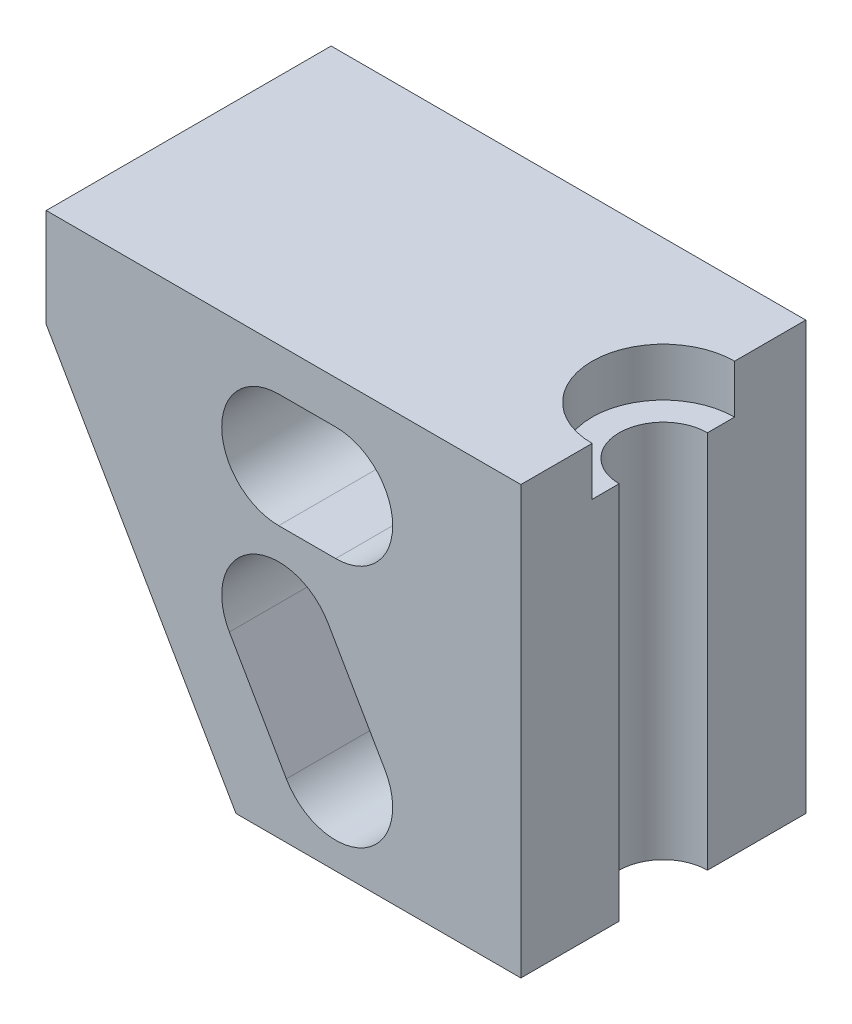
ISO-10303-21;
HEADER;
FILE_DESCRIPTION(('STEP AP214'),'2;1');
FILE_NAME('part.step','',(''),(''),'','','');
FILE_SCHEMA(('AUTOMOTIVE_DESIGN { 1 0 10303 214 1 1 1 1 }'));
ENDSEC;
DATA;
#1=APPLICATION_CONTEXT('core data for automotive mechanical design processes');
#2=APPLICATION_PROTOCOL_DEFINITION('international standard','automotive_design',2000,#1);
#3=PRODUCT_CONTEXT('',#1,'mechanical');
#4=PRODUCT('Part','Part','',(#3));
#5=PRODUCT_RELATED_PRODUCT_CATEGORY('part','',(#4));
#6=PRODUCT_DEFINITION_FORMATION('','',#4);
#7=PRODUCT_DEFINITION_CONTEXT('part definition',#1,'design');
#8=PRODUCT_DEFINITION('design','',#6,#7);
#9=PRODUCT_DEFINITION_SHAPE('','',#8);
#10=(LENGTH_UNIT() NAMED_UNIT(*) SI_UNIT(.MILLI.,.METRE.));
#11=(NAMED_UNIT(*) PLANE_ANGLE_UNIT() SI_UNIT($,.RADIAN.));
#12=(NAMED_UNIT(*) SI_UNIT($,.STERADIAN.) SOLID_ANGLE_UNIT());
#13=UNCERTAINTY_MEASURE_WITH_UNIT(LENGTH_MEASURE(1.E-05),#10,'distance_accuracy_value','');
#14=(GEOMETRIC_REPRESENTATION_CONTEXT(3) GLOBAL_UNCERTAINTY_ASSIGNED_CONTEXT((#13)) GLOBAL_UNIT_ASSIGNED_CONTEXT((#10,
#11,#12)) REPRESENTATION_CONTEXT('',''));
#15=CARTESIAN_POINT('',(0.,0.,0.));
#16=DIRECTION('',(0.,0.,1.));
#17=DIRECTION('',(1.,0.,0.));
#18=AXIS2_PLACEMENT_3D('',#15,#16,#17);
#19=CARTESIAN_POINT('',(0.,15.,5.));
#20=DIRECTION('',(0.,-1.,0.));
#21=DIRECTION('',(0.,0.,-1.));
#22=AXIS2_PLACEMENT_3D('',#19,#20,#21);
#23=CYLINDRICAL_SURFACE('',#22,1.55);
#24=CARTESIAN_POINT('',(0.,13.3,5.));
#25=DIRECTION('',(0.,1.,0.));
#26=DIRECTION('',(-1.,0.,0.));
#27=AXIS2_PLACEMENT_3D('',#24,#25,#26);
#28=CIRCLE('',#27,1.55);
#29=CARTESIAN_POINT('',(0.,13.3,6.55));
#30=VERTEX_POINT('',#29);
#31=CARTESIAN_POINT('',(0.,13.3,3.45));
#32=VERTEX_POINT('',#31);
#33=EDGE_CURVE('E12',#30,#32,#28,.F.);
#34=ORIENTED_EDGE('',*,*,#33,.F.);
#35=DIRECTION('',(0.,-1.,0.));
#36=VECTOR('',#35,1.);
#37=CARTESIAN_POINT('',(0.,15.,6.55));
#38=LINE('',#37,#36);
#39=CARTESIAN_POINT('',(0.,0.,6.55));
#40=VERTEX_POINT('',#39);
#41=EDGE_CURVE('E272',#40,#30,#38,.F.);
#42=ORIENTED_EDGE('',*,*,#41,.F.);
#43=CARTESIAN_POINT('',(0.,0.,5.));
#44=DIRECTION('',(0.,-1.,0.));
#45=DIRECTION('',(0.,0.,-1.));
#46=AXIS2_PLACEMENT_3D('',#43,#44,#45);
#47=CIRCLE('',#46,1.55);
#48=CARTESIAN_POINT('',(0.,0.,3.45));
#49=VERTEX_POINT('',#48);
#50=EDGE_CURVE('E362',#40,#49,#47,.T.);
#51=ORIENTED_EDGE('',*,*,#50,.T.);
#52=DIRECTION('',(0.,-1.,0.));
#53=VECTOR('',#52,1.);
#54=CARTESIAN_POINT('',(0.,15.,3.45));
#55=LINE('',#54,#53);
#56=EDGE_CURVE('E269',#32,#49,#55,.T.);
#57=ORIENTED_EDGE('',*,*,#56,.F.);
#58=EDGE_LOOP('',(#34,#42,#51,#57));
#59=FACE_BOUND('',#58,.T.);
#60=ADVANCED_FACE('F47',(#59),#23,.F.);
#61=CARTESIAN_POINT('',(0.,0.,10.));
#62=DIRECTION('',(-1.,0.,0.));
#63=DIRECTION('',(0.,0.,1.));
#64=AXIS2_PLACEMENT_3D('',#61,#62,#63);
#65=PLANE('',#64);
#66=DIRECTION('',(0.,0.,-1.));
#67=VECTOR('',#66,1.);
#68=CARTESIAN_POINT('',(0.,15.,10.));
#69=LINE('',#68,#67);
#70=CARTESIAN_POINT('',(0.,15.,2.5));
#71=VERTEX_POINT('',#70);
#72=CARTESIAN_POINT('',(0.,15.,0.));
#73=VERTEX_POINT('',#72);
#74=EDGE_CURVE('E214',#71,#73,#69,.T.);
#75=ORIENTED_EDGE('',*,*,#74,.F.);
#76=DIRECTION('',(0.,1.,0.));
#77=VECTOR('',#76,1.);
#78=CARTESIAN_POINT('',(0.,13.3,2.5));
#79=LINE('',#78,#77);
#80=CARTESIAN_POINT('',(0.,13.3,2.5));
#81=VERTEX_POINT('',#80);
#82=EDGE_CURVE('E358',#71,#81,#79,.F.);
#83=ORIENTED_EDGE('',*,*,#82,.T.);
#84=DIRECTION('',(0.,0.,-1.));
#85=VECTOR('',#84,1.);
#86=CARTESIAN_POINT('',(0.,13.3,10.));
#87=LINE('',#86,#85);
#88=EDGE_CURVE('E351',#32,#81,#87,.T.);
#89=ORIENTED_EDGE('',*,*,#88,.F.);
#90=ORIENTED_EDGE('',*,*,#56,.T.);
#91=DIRECTION('',(0.,0.,-1.));
#92=VECTOR('',#91,1.);
#93=CARTESIAN_POINT('',(0.,0.,10.));
#94=LINE('',#93,#92);
#95=CARTESIAN_POINT('',(0.,0.,0.));
#96=VERTEX_POINT('',#95);
#97=EDGE_CURVE('E213',#49,#96,#94,.T.);
#98=ORIENTED_EDGE('',*,*,#97,.T.);
#99=DIRECTION('',(0.,1.,0.));
#100=VECTOR('',#99,1.);
#101=CARTESIAN_POINT('',(0.,0.,0.));
#102=LINE('',#101,#100);
#103=EDGE_CURVE('E195',#96,#73,#102,.T.);
#104=ORIENTED_EDGE('',*,*,#103,.T.);
#105=EDGE_LOOP('',(#75,#83,#89,#90,#98,#104));
#106=FACE_BOUND('',#105,.T.);
#107=ADVANCED_FACE('F394',(#106),#65,.F.);
#108=CARTESIAN_POINT('',(-7.50000000000002,-4.33012701892218,10.));
#109=DIRECTION('',(0.86602540378444,0.499999999999998,0.));
#110=DIRECTION('',(-0.499999999999998,0.86602540378444,0.));
#111=AXIS2_PLACEMENT_3D('',#108,#109,#110);
#112=PLANE('',#111);
#113=DIRECTION('',(0.499999999999998,-0.86602540378444,0.));
#114=VECTOR('',#113,1.);
#115=CARTESIAN_POINT('',(-7.50000000000002,-4.33012701892218,10.));
#116=LINE('',#115,#114);
#117=CARTESIAN_POINT('',(-16.6602540378443,11.5358983848622,10.));
#118=VERTEX_POINT('',#117);
#119=CARTESIAN_POINT('',(-10.,0.,10.));
#120=VERTEX_POINT('',#119);
#121=EDGE_CURVE('E182',#118,#120,#116,.T.);
#122=ORIENTED_EDGE('',*,*,#121,.F.);
#123=DIRECTION('',(0.,0.,1.));
#124=VECTOR('',#123,1.);
#125=CARTESIAN_POINT('',(-16.6602540378443,11.5358983848622,0.));
#126=LINE('',#125,#124);
#127=CARTESIAN_POINT('',(-16.6602540378443,11.5358983848622,0.));
#128=VERTEX_POINT('',#127);
#129=EDGE_CURVE('E167',#128,#118,#126,.T.);
#130=ORIENTED_EDGE('',*,*,#129,.F.);
#131=DIRECTION('',(0.499999999999998,-0.86602540378444,0.));
#132=VECTOR('',#131,1.);
#133=CARTESIAN_POINT('',(-7.50000000000002,-4.33012701892218,0.));
#134=LINE('',#133,#132);
#135=CARTESIAN_POINT('',(-10.,0.,0.));
#136=VERTEX_POINT('',#135);
#137=EDGE_CURVE('E180',#128,#136,#134,.T.);
#138=ORIENTED_EDGE('',*,*,#137,.T.);
#139=DIRECTION('',(0.,0.,-1.));
#140=VECTOR('',#139,1.);
#141=CARTESIAN_POINT('',(-10.,0.,10.));
#142=LINE('',#141,#140);
#143=EDGE_CURVE('E56',#120,#136,#142,.T.);
#144=ORIENTED_EDGE('',*,*,#143,.F.);
#145=EDGE_LOOP('',(#122,#130,#138,#144));
#146=FACE_BOUND('',#145,.T.);
#147=ADVANCED_FACE('F178',(#146),#112,.F.);
#148=CARTESIAN_POINT('',(0.,0.,10.));
#149=DIRECTION('',(0.,1.,0.));
#150=DIRECTION('',(0.,0.,1.));
#151=AXIS2_PLACEMENT_3D('',#148,#149,#150);
#152=PLANE('',#151);
#153=ORIENTED_EDGE('',*,*,#97,.F.);
#154=ORIENTED_EDGE('',*,*,#50,.F.);
#155=CARTESIAN_POINT('',(0.,0.,10.));
#156=VERTEX_POINT('',#155);
#157=EDGE_CURVE('E215',#156,#40,#94,.T.);
#158=ORIENTED_EDGE('',*,*,#157,.F.);
#159=DIRECTION('',(1.,0.,0.));
#160=VECTOR('',#159,1.);
#161=CARTESIAN_POINT('',(0.,0.,10.));
#162=LINE('',#161,#160);
#163=EDGE_CURVE('E320',#120,#156,#162,.T.);
#164=ORIENTED_EDGE('',*,*,#163,.F.);
#165=ORIENTED_EDGE('',*,*,#143,.T.);
#166=DIRECTION('',(1.,0.,0.));
#167=VECTOR('',#166,1.);
#168=CARTESIAN_POINT('',(0.,0.,0.));
#169=LINE('',#168,#167);
#170=EDGE_CURVE('E188',#136,#96,#169,.T.);
#171=ORIENTED_EDGE('',*,*,#170,.T.);
#172=EDGE_LOOP('',(#153,#154,#158,#164,#165,#171));
#173=FACE_BOUND('',#172,.T.);
#174=ADVANCED_FACE('F494',(#173),#152,.F.);
#175=DIRECTION('',(0.,0.,-1.));
#176=VECTOR('',#175,1.);
#177=CARTESIAN_POINT('',(0.,13.3,10.));
#178=LINE('',#177,#176);
#179=CARTESIAN_POINT('',(0.,13.3,7.5));
#180=VERTEX_POINT('',#179);
#181=EDGE_CURVE('E70',#180,#30,#178,.T.);
#182=ORIENTED_EDGE('',*,*,#181,.F.);
#183=DIRECTION('',(0.,1.,0.));
#184=VECTOR('',#183,1.);
#185=CARTESIAN_POINT('',(0.,13.3,7.5));
#186=LINE('',#185,#184);
#187=CARTESIAN_POINT('',(0.,15.,7.5));
#188=VERTEX_POINT('',#187);
#189=EDGE_CURVE('E354',#180,#188,#186,.T.);
#190=ORIENTED_EDGE('',*,*,#189,.T.);
#191=CARTESIAN_POINT('',(0.,15.,10.));
#192=VERTEX_POINT('',#191);
#193=EDGE_CURVE('E209',#192,#188,#69,.T.);
#194=ORIENTED_EDGE('',*,*,#193,.F.);
#195=DIRECTION('',(0.,1.,0.));
#196=VECTOR('',#195,1.);
#197=CARTESIAN_POINT('',(0.,0.,10.));
#198=LINE('',#197,#196);
#199=EDGE_CURVE('E326',#156,#192,#198,.T.);
#200=ORIENTED_EDGE('',*,*,#199,.F.);
#201=ORIENTED_EDGE('',*,*,#157,.T.);
#202=ORIENTED_EDGE('',*,*,#41,.T.);
#203=EDGE_LOOP('',(#182,#190,#194,#200,#201,#202));
#204=FACE_BOUND('',#203,.T.);
#205=ADVANCED_FACE('F401',(#204),#65,.F.);
#206=CARTESIAN_POINT('',(-8.5,6.40192378864671,10.));
#207=DIRECTION('',(0.,0.,-1.));
#208=DIRECTION('',(-1.,0.,0.));
#209=AXIS2_PLACEMENT_3D('',#206,#207,#208);
#210=CYLINDRICAL_SURFACE('',#209,2.);
#211=CARTESIAN_POINT('',(-8.5,6.40192378864671,0.));
#212=DIRECTION('',(0.,0.,1.));
#213=DIRECTION('',(1.,0.,0.));
#214=AXIS2_PLACEMENT_3D('',#211,#212,#213);
#215=CIRCLE('',#214,2.);
#216=CARTESIAN_POINT('',(-6.76794919243112,7.4019237886467,0.));
#217=VERTEX_POINT('',#216);
#218=CARTESIAN_POINT('',(-10.2320508075689,5.40192378864671,0.));
#219=VERTEX_POINT('',#218);
#220=EDGE_CURVE('E282',#217,#219,#215,.T.);
#221=ORIENTED_EDGE('',*,*,#220,.F.);
#222=DIRECTION('',(0.,0.,-1.));
#223=VECTOR('',#222,1.);
#224=CARTESIAN_POINT('',(-6.76794919243112,7.4019237886467,10.));
#225=LINE('',#224,#223);
#226=CARTESIAN_POINT('',(-6.76794919243112,7.4019237886467,10.));
#227=VERTEX_POINT('',#226);
#228=EDGE_CURVE('E231',#227,#217,#225,.T.);
#229=ORIENTED_EDGE('',*,*,#228,.F.);
#230=CARTESIAN_POINT('',(-8.5,6.40192378864671,10.));
#231=DIRECTION('',(0.,0.,1.));
#232=DIRECTION('',(1.,0.,0.));
#233=AXIS2_PLACEMENT_3D('',#230,#231,#232);
#234=CIRCLE('',#233,2.);
#235=CARTESIAN_POINT('',(-10.2320508075689,5.40192378864671,10.));
#236=VERTEX_POINT('',#235);
#237=EDGE_CURVE('E309',#227,#236,#234,.T.);
#238=ORIENTED_EDGE('',*,*,#237,.T.);
#239=DIRECTION('',(0.,0.,-1.));
#240=VECTOR('',#239,1.);
#241=CARTESIAN_POINT('',(-10.2320508075689,5.40192378864671,10.));
#242=LINE('',#241,#240);
#243=EDGE_CURVE('E221',#236,#219,#242,.T.);
#244=ORIENTED_EDGE('',*,*,#243,.T.);
#245=EDGE_LOOP('',(#221,#229,#238,#244));
#246=FACE_BOUND('',#245,.T.);
#247=ADVANCED_FACE('F308',(#246),#210,.F.);
#248=CARTESIAN_POINT('',(-1.87083487540116,-1.0801270189222,10.));
#249=DIRECTION('',(0.86602540378444,0.499999999999998,0.));
#250=DIRECTION('',(-0.499999999999998,0.86602540378444,0.));
#251=AXIS2_PLACEMENT_3D('',#248,#249,#250);
#252=PLANE('',#251);
#253=DIRECTION('',(0.499999999999998,-0.86602540378444,0.));
#254=VECTOR('',#253,1.);
#255=CARTESIAN_POINT('',(-1.87083487540116,-1.0801270189222,0.));
#256=LINE('',#255,#254);
#257=CARTESIAN_POINT('',(-4.76794919243112,3.93782217350892,0.));
#258=VERTEX_POINT('',#257);
#259=EDGE_CURVE('E286',#217,#258,#256,.T.);
#260=ORIENTED_EDGE('',*,*,#259,.T.);
#261=DIRECTION('',(0.,0.,-1.));
#262=VECTOR('',#261,1.);
#263=CARTESIAN_POINT('',(-4.76794919243112,3.93782217350892,10.));
#264=LINE('',#263,#262);
#265=CARTESIAN_POINT('',(-4.76794919243112,3.93782217350892,10.));
#266=VERTEX_POINT('',#265);
#267=EDGE_CURVE('E228',#266,#258,#264,.T.);
#268=ORIENTED_EDGE('',*,*,#267,.F.);
#269=DIRECTION('',(0.499999999999998,-0.86602540378444,0.));
#270=VECTOR('',#269,1.);
#271=CARTESIAN_POINT('',(-1.87083487540116,-1.0801270189222,10.));
#272=LINE('',#271,#270);
#273=EDGE_CURVE('E304',#227,#266,#272,.T.);
#274=ORIENTED_EDGE('',*,*,#273,.F.);
#275=ORIENTED_EDGE('',*,*,#228,.T.);
#276=EDGE_LOOP('',(#260,#268,#274,#275));
#277=FACE_BOUND('',#276,.T.);
#278=ADVANCED_FACE('F303',(#277),#252,.F.);
#279=CARTESIAN_POINT('',(-6.5,2.93782217350893,10.));
#280=DIRECTION('',(0.,0.,-1.));
#281=DIRECTION('',(-1.,0.,0.));
#282=AXIS2_PLACEMENT_3D('',#279,#280,#281);
#283=CYLINDRICAL_SURFACE('',#282,2.);
#284=CARTESIAN_POINT('',(-6.5,2.93782217350893,0.));
#285=DIRECTION('',(0.,0.,1.));
#286=DIRECTION('',(1.,0.,0.));
#287=AXIS2_PLACEMENT_3D('',#284,#285,#286);
#288=CIRCLE('',#287,2.);
#289=CARTESIAN_POINT('',(-8.23205080756887,1.93782217350893,0.));
#290=VERTEX_POINT('',#289);
#291=EDGE_CURVE('E198',#290,#258,#288,.T.);
#292=ORIENTED_EDGE('',*,*,#291,.F.);
#293=DIRECTION('',(0.,0.,-1.));
#294=VECTOR('',#293,1.);
#295=CARTESIAN_POINT('',(-8.23205080756887,1.93782217350893,10.));
#296=LINE('',#295,#294);
#297=CARTESIAN_POINT('',(-8.23205080756887,1.93782217350893,10.));
#298=VERTEX_POINT('',#297);
#299=EDGE_CURVE('E224',#298,#290,#296,.T.);
#300=ORIENTED_EDGE('',*,*,#299,.F.);
#301=CARTESIAN_POINT('',(-6.5,2.93782217350893,10.));
#302=DIRECTION('',(0.,0.,1.));
#303=DIRECTION('',(1.,0.,0.));
#304=AXIS2_PLACEMENT_3D('',#301,#302,#303);
#305=CIRCLE('',#304,2.);
#306=EDGE_CURVE('E300',#298,#266,#305,.T.);
#307=ORIENTED_EDGE('',*,*,#306,.T.);
#308=ORIENTED_EDGE('',*,*,#267,.T.);
#309=EDGE_LOOP('',(#292,#300,#307,#308));
#310=FACE_BOUND('',#309,.T.);
#311=ADVANCED_FACE('F296',(#310),#283,.F.);
#312=CARTESIAN_POINT('',(-6.5,11.5,10.));
#313=DIRECTION('',(0.,0.,-1.));
#314=DIRECTION('',(-1.,0.,0.));
#315=AXIS2_PLACEMENT_3D('',#312,#313,#314);
#316=CYLINDRICAL_SURFACE('',#315,2.);
#317=CARTESIAN_POINT('',(-6.5,11.5,0.));
#318=DIRECTION('',(0.,0.,1.));
#319=DIRECTION('',(1.,0.,0.));
#320=AXIS2_PLACEMENT_3D('',#317,#318,#319);
#321=CIRCLE('',#320,2.);
#322=CARTESIAN_POINT('',(-6.5,9.5,0.));
#323=VERTEX_POINT('',#322);
#324=CARTESIAN_POINT('',(-6.5,13.5,0.));
#325=VERTEX_POINT('',#324);
#326=EDGE_CURVE('E261',#323,#325,#321,.T.);
#327=ORIENTED_EDGE('',*,*,#326,.F.);
#328=DIRECTION('',(0.,0.,-1.));
#329=VECTOR('',#328,1.);
#330=CARTESIAN_POINT('',(-6.5,9.5,10.));
#331=LINE('',#330,#329);
#332=CARTESIAN_POINT('',(-6.5,9.5,10.));
#333=VERTEX_POINT('',#332);
#334=EDGE_CURVE('E225',#333,#323,#331,.T.);
#335=ORIENTED_EDGE('',*,*,#334,.F.);
#336=CARTESIAN_POINT('',(-6.5,11.5,10.));
#337=DIRECTION('',(0.,0.,1.));
#338=DIRECTION('',(1.,0.,0.));
#339=AXIS2_PLACEMENT_3D('',#336,#337,#338);
#340=CIRCLE('',#339,2.);
#341=CARTESIAN_POINT('',(-6.5,13.5,10.));
#342=VERTEX_POINT('',#341);
#343=EDGE_CURVE('E208',#333,#342,#340,.T.);
#344=ORIENTED_EDGE('',*,*,#343,.T.);
#345=DIRECTION('',(0.,0.,-1.));
#346=VECTOR('',#345,1.);
#347=CARTESIAN_POINT('',(-6.5,13.5,10.));
#348=LINE('',#347,#346);
#349=EDGE_CURVE('E234',#342,#325,#348,.T.);
#350=ORIENTED_EDGE('',*,*,#349,.T.);
#351=EDGE_LOOP('',(#327,#335,#344,#350));
#352=FACE_BOUND('',#351,.T.);
#353=ADVANCED_FACE('F49',(#352),#316,.F.);
#354=CARTESIAN_POINT('',(0.,9.5,10.));
#355=DIRECTION('',(0.,-1.,0.));
#356=DIRECTION('',(0.,0.,-1.));
#357=AXIS2_PLACEMENT_3D('',#354,#355,#356);
#358=PLANE('',#357);
#359=DIRECTION('',(-1.,0.,0.));
#360=VECTOR('',#359,1.);
#361=CARTESIAN_POINT('',(0.,9.5,0.));
#362=LINE('',#361,#360);
#363=CARTESIAN_POINT('',(-8.5,9.5,0.));
#364=VERTEX_POINT('',#363);
#365=EDGE_CURVE('E250',#323,#364,#362,.T.);
#366=ORIENTED_EDGE('',*,*,#365,.T.);
#367=DIRECTION('',(0.,0.,-1.));
#368=VECTOR('',#367,1.);
#369=CARTESIAN_POINT('',(-8.5,9.5,10.));
#370=LINE('',#369,#368);
#371=CARTESIAN_POINT('',(-8.5,9.5,10.));
#372=VERTEX_POINT('',#371);
#373=EDGE_CURVE('E241',#372,#364,#370,.T.);
#374=ORIENTED_EDGE('',*,*,#373,.F.);
#375=DIRECTION('',(-1.,0.,0.));
#376=VECTOR('',#375,1.);
#377=CARTESIAN_POINT('',(0.,9.5,10.));
#378=LINE('',#377,#376);
#379=EDGE_CURVE('E252',#333,#372,#378,.T.);
#380=ORIENTED_EDGE('',*,*,#379,.F.);
#381=ORIENTED_EDGE('',*,*,#334,.T.);
#382=EDGE_LOOP('',(#366,#374,#380,#381));
#383=FACE_BOUND('',#382,.T.);
#384=ADVANCED_FACE('F248',(#383),#358,.F.);
#385=CARTESIAN_POINT('',(-8.5,11.5,10.));
#386=DIRECTION('',(0.,0.,-1.));
#387=DIRECTION('',(-1.,0.,0.));
#388=AXIS2_PLACEMENT_3D('',#385,#386,#387);
#389=CYLINDRICAL_SURFACE('',#388,2.);
#390=CARTESIAN_POINT('',(-8.5,11.5,0.));
#391=DIRECTION('',(0.,0.,1.));
#392=DIRECTION('',(1.,0.,0.));
#393=AXIS2_PLACEMENT_3D('',#390,#391,#392);
#394=CIRCLE('',#393,2.);
#395=CARTESIAN_POINT('',(-8.5,13.5,0.));
#396=VERTEX_POINT('',#395);
#397=EDGE_CURVE('E263',#396,#364,#394,.T.);
#398=ORIENTED_EDGE('',*,*,#397,.F.);
#399=DIRECTION('',(0.,0.,-1.));
#400=VECTOR('',#399,1.);
#401=CARTESIAN_POINT('',(-8.5,13.5,10.));
#402=LINE('',#401,#400);
#403=CARTESIAN_POINT('',(-8.5,13.5,10.));
#404=VERTEX_POINT('',#403);
#405=EDGE_CURVE('E237',#404,#396,#402,.T.);
#406=ORIENTED_EDGE('',*,*,#405,.F.);
#407=CARTESIAN_POINT('',(-8.5,11.5,10.));
#408=DIRECTION('',(0.,0.,1.));
#409=DIRECTION('',(1.,0.,0.));
#410=AXIS2_PLACEMENT_3D('',#407,#408,#409);
#411=CIRCLE('',#410,2.);
#412=EDGE_CURVE('E373',#404,#372,#411,.T.);
#413=ORIENTED_EDGE('',*,*,#412,.T.);
#414=ORIENTED_EDGE('',*,*,#373,.T.);
#415=EDGE_LOOP('',(#398,#406,#413,#414));
#416=FACE_BOUND('',#415,.T.);
#417=ADVANCED_FACE('F453',(#416),#389,.F.);
#418=CARTESIAN_POINT('',(-5.33493649053892,-3.08012701892219,10.));
#419=DIRECTION('',(0.86602540378444,0.499999999999998,0.));
#420=DIRECTION('',(-0.499999999999998,0.86602540378444,0.));
#421=AXIS2_PLACEMENT_3D('',#418,#419,#420);
#422=PLANE('',#421);
#423=DIRECTION('',(0.499999999999998,-0.86602540378444,0.));
#424=VECTOR('',#423,1.);
#425=CARTESIAN_POINT('',(-5.33493649053892,-3.08012701892219,0.));
#426=LINE('',#425,#424);
#427=EDGE_CURVE('E191',#219,#290,#426,.T.);
#428=ORIENTED_EDGE('',*,*,#427,.F.);
#429=ORIENTED_EDGE('',*,*,#243,.F.);
#430=DIRECTION('',(0.499999999999998,-0.86602540378444,0.));
#431=VECTOR('',#430,1.);
#432=CARTESIAN_POINT('',(-5.33493649053892,-3.08012701892219,10.));
#433=LINE('',#432,#431);
#434=EDGE_CURVE('E314',#236,#298,#433,.T.);
#435=ORIENTED_EDGE('',*,*,#434,.T.);
#436=ORIENTED_EDGE('',*,*,#299,.T.);
#437=EDGE_LOOP('',(#428,#429,#435,#436));
#438=FACE_BOUND('',#437,.T.);
#439=ADVANCED_FACE('F312',(#438),#422,.T.);
#440=CARTESIAN_POINT('',(0.,13.5,10.));
#441=DIRECTION('',(0.,1.,0.));
#442=DIRECTION('',(0.,0.,1.));
#443=AXIS2_PLACEMENT_3D('',#440,#441,#442);
#444=PLANE('',#443);
#445=DIRECTION('',(1.,0.,0.));
#446=VECTOR('',#445,1.);
#447=CARTESIAN_POINT('',(0.,13.5,0.));
#448=LINE('',#447,#446);
#449=EDGE_CURVE('E279',#396,#325,#448,.T.);
#450=ORIENTED_EDGE('',*,*,#449,.T.);
#451=ORIENTED_EDGE('',*,*,#349,.F.);
#452=DIRECTION('',(1.,0.,0.));
#453=VECTOR('',#452,1.);
#454=CARTESIAN_POINT('',(0.,13.5,10.));
#455=LINE('',#454,#453);
#456=EDGE_CURVE('E377',#404,#342,#455,.T.);
#457=ORIENTED_EDGE('',*,*,#456,.F.);
#458=ORIENTED_EDGE('',*,*,#405,.T.);
#459=EDGE_LOOP('',(#450,#451,#457,#458));
#460=FACE_BOUND('',#459,.T.);
#461=ADVANCED_FACE('F390',(#460),#444,.F.);
#462=CARTESIAN_POINT('',(0.,15.,10.));
#463=DIRECTION('',(0.,-1.,0.));
#464=DIRECTION('',(1.,0.,0.));
#465=AXIS2_PLACEMENT_3D('',#462,#463,#464);
#466=PLANE('',#465);
#467=DIRECTION('',(-1.,0.,0.));
#468=VECTOR('',#467,1.);
#469=CARTESIAN_POINT('',(0.,15.,0.));
#470=LINE('',#469,#468);
#471=CARTESIAN_POINT('',(-16.6602540378443,15.,0.));
#472=VERTEX_POINT('',#471);
#473=EDGE_CURVE('E205',#73,#472,#470,.T.);
#474=ORIENTED_EDGE('',*,*,#473,.T.);
#475=DIRECTION('',(0.,0.,1.));
#476=VECTOR('',#475,1.);
#477=CARTESIAN_POINT('',(-16.6602540378443,15.,0.));
#478=LINE('',#477,#476);
#479=CARTESIAN_POINT('',(-16.6602540378443,15.,10.));
#480=VERTEX_POINT('',#479);
#481=EDGE_CURVE('E63',#472,#480,#478,.T.);
#482=ORIENTED_EDGE('',*,*,#481,.T.);
#483=DIRECTION('',(-1.,0.,0.));
#484=VECTOR('',#483,1.);
#485=CARTESIAN_POINT('',(0.,15.,10.));
#486=LINE('',#485,#484);
#487=EDGE_CURVE('E238',#192,#480,#486,.T.);
#488=ORIENTED_EDGE('',*,*,#487,.F.);
#489=ORIENTED_EDGE('',*,*,#193,.T.);
#490=CARTESIAN_POINT('',(0.,15.,5.));
#491=DIRECTION('',(0.,1.,0.));
#492=DIRECTION('',(-1.,0.,0.));
#493=AXIS2_PLACEMENT_3D('',#490,#491,#492);
#494=CIRCLE('',#493,2.5);
#495=EDGE_CURVE('E340',#71,#188,#494,.T.);
#496=ORIENTED_EDGE('',*,*,#495,.F.);
#497=ORIENTED_EDGE('',*,*,#74,.T.);
#498=EDGE_LOOP('',(#474,#482,#488,#489,#496,#497));
#499=FACE_BOUND('',#498,.T.);
#500=ADVANCED_FACE('F337',(#499),#466,.F.);
#501=CARTESIAN_POINT('',(0.,0.,10.));
#502=DIRECTION('',(0.,0.,1.));
#503=DIRECTION('',(1.,0.,0.));
#504=AXIS2_PLACEMENT_3D('',#501,#502,#503);
#505=PLANE('',#504);
#506=DIRECTION('',(0.,1.,0.));
#507=VECTOR('',#506,1.);
#508=CARTESIAN_POINT('',(-16.6602540378443,15.,10.));
#509=LINE('',#508,#507);
#510=EDGE_CURVE('E174',#118,#480,#509,.T.);
#511=ORIENTED_EDGE('',*,*,#510,.F.);
#512=ORIENTED_EDGE('',*,*,#121,.T.);
#513=ORIENTED_EDGE('',*,*,#163,.T.);
#514=ORIENTED_EDGE('',*,*,#199,.T.);
#515=ORIENTED_EDGE('',*,*,#487,.T.);
#516=EDGE_LOOP('',(#511,#512,#513,#514,#515));
#517=FACE_BOUND('',#516,.T.);
#518=ORIENTED_EDGE('',*,*,#343,.F.);
#519=ORIENTED_EDGE('',*,*,#379,.T.);
#520=ORIENTED_EDGE('',*,*,#412,.F.);
#521=ORIENTED_EDGE('',*,*,#456,.T.);
#522=EDGE_LOOP('',(#518,#519,#520,#521));
#523=FACE_BOUND('',#522,.T.);
#524=ORIENTED_EDGE('',*,*,#237,.F.);
#525=ORIENTED_EDGE('',*,*,#273,.T.);
#526=ORIENTED_EDGE('',*,*,#306,.F.);
#527=ORIENTED_EDGE('',*,*,#434,.F.);
#528=EDGE_LOOP('',(#524,#525,#526,#527));
#529=FACE_BOUND('',#528,.T.);
#530=ADVANCED_FACE('F334',(#517,#523,#529),#505,.T.);
#531=CARTESIAN_POINT('',(0.,0.,0.));
#532=DIRECTION('',(0.,0.,1.));
#533=DIRECTION('',(1.,0.,0.));
#534=AXIS2_PLACEMENT_3D('',#531,#532,#533);
#535=PLANE('',#534);
#536=ORIENTED_EDGE('',*,*,#326,.T.);
#537=ORIENTED_EDGE('',*,*,#449,.F.);
#538=ORIENTED_EDGE('',*,*,#397,.T.);
#539=ORIENTED_EDGE('',*,*,#365,.F.);
#540=EDGE_LOOP('',(#536,#537,#538,#539));
#541=FACE_BOUND('',#540,.T.);
#542=ORIENTED_EDGE('',*,*,#220,.T.);
#543=ORIENTED_EDGE('',*,*,#427,.T.);
#544=ORIENTED_EDGE('',*,*,#291,.T.);
#545=ORIENTED_EDGE('',*,*,#259,.F.);
#546=EDGE_LOOP('',(#542,#543,#544,#545));
#547=FACE_BOUND('',#546,.T.);
#548=ORIENTED_EDGE('',*,*,#137,.F.);
#549=DIRECTION('',(0.,1.,0.));
#550=VECTOR('',#549,1.);
#551=CARTESIAN_POINT('',(-16.6602540378443,15.,0.));
#552=LINE('',#551,#550);
#553=EDGE_CURVE('E164',#128,#472,#552,.T.);
#554=ORIENTED_EDGE('',*,*,#553,.T.);
#555=ORIENTED_EDGE('',*,*,#473,.F.);
#556=ORIENTED_EDGE('',*,*,#103,.F.);
#557=ORIENTED_EDGE('',*,*,#170,.F.);
#558=EDGE_LOOP('',(#548,#554,#555,#556,#557));
#559=FACE_BOUND('',#558,.T.);
#560=ADVANCED_FACE('F185',(#541,#547,#559),#535,.F.);
#561=CARTESIAN_POINT('',(0.,13.3,5.));
#562=DIRECTION('',(0.,1.,0.));
#563=DIRECTION('',(-1.,0.,0.));
#564=AXIS2_PLACEMENT_3D('',#561,#562,#563);
#565=CYLINDRICAL_SURFACE('',#564,2.5);
#566=ORIENTED_EDGE('',*,*,#495,.T.);
#567=ORIENTED_EDGE('',*,*,#189,.F.);
#568=CARTESIAN_POINT('',(0.,13.3,5.));
#569=DIRECTION('',(0.,1.,0.));
#570=DIRECTION('',(-1.,0.,0.));
#571=AXIS2_PLACEMENT_3D('',#568,#569,#570);
#572=CIRCLE('',#571,2.5);
#573=EDGE_CURVE('E343',#81,#180,#572,.T.);
#574=ORIENTED_EDGE('',*,*,#573,.F.);
#575=ORIENTED_EDGE('',*,*,#82,.F.);
#576=EDGE_LOOP('',(#566,#567,#574,#575));
#577=FACE_BOUND('',#576,.T.);
#578=ADVANCED_FACE('F388',(#577),#565,.F.);
#579=CARTESIAN_POINT('',(0.,13.3,5.));
#580=DIRECTION('',(0.,1.,0.));
#581=DIRECTION('',(-1.,0.,0.));
#582=AXIS2_PLACEMENT_3D('',#579,#580,#581);
#583=PLANE('',#582);
#584=ORIENTED_EDGE('',*,*,#88,.T.);
#585=ORIENTED_EDGE('',*,*,#573,.T.);
#586=ORIENTED_EDGE('',*,*,#181,.T.);
#587=ORIENTED_EDGE('',*,*,#33,.T.);
#588=EDGE_LOOP('',(#584,#585,#586,#587));
#589=FACE_BOUND('',#588,.T.);
#590=ADVANCED_FACE('F405',(#589),#583,.T.);
#591=CARTESIAN_POINT('',(-16.6602540378443,15.,0.));
#592=DIRECTION('',(1.,0.,0.));
#593=DIRECTION('',(0.,0.,-1.));
#594=AXIS2_PLACEMENT_3D('',#591,#592,#593);
#595=PLANE('',#594);
#596=ORIENTED_EDGE('',*,*,#510,.T.);
#597=ORIENTED_EDGE('',*,*,#481,.F.);
#598=ORIENTED_EDGE('',*,*,#553,.F.);
#599=ORIENTED_EDGE('',*,*,#129,.T.);
#600=EDGE_LOOP('',(#596,#597,#598,#599));
#601=FACE_BOUND('',#600,.T.);
#602=ADVANCED_FACE('F166',(#601),#595,.F.);
#603=CLOSED_SHELL('',(#60,#107,#147,#174,#205,#247,#278,#311,#353,#384,#417,#439,#461,#500,#530,
#560,#578,#590,#602));
#604=MANIFOLD_SOLID_BREP('B2',#603);
#605=ADVANCED_BREP_SHAPE_REPRESENTATION('',(#18,#604),#14);
#606=SHAPE_DEFINITION_REPRESENTATION(#9,#605);
ENDSEC;
END-ISO-10303-21;
